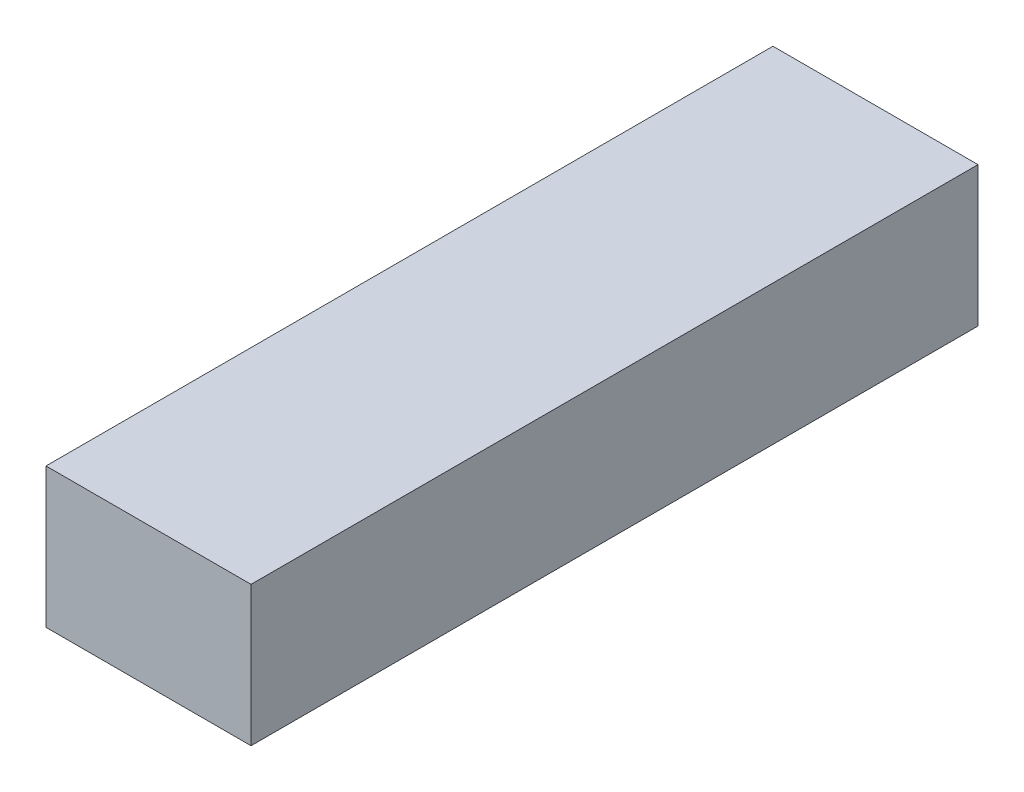
ISO-10303-21;
HEADER;
FILE_DESCRIPTION(('STEP AP214'),'2;1');
FILE_NAME('part.step','',(''),(''),'','','');
FILE_SCHEMA(('AUTOMOTIVE_DESIGN { 1 0 10303 214 1 1 1 1 }'));
ENDSEC;
DATA;
#1=APPLICATION_CONTEXT('core data for automotive mechanical design processes');
#2=APPLICATION_PROTOCOL_DEFINITION('international standard','automotive_design',2000,#1);
#3=PRODUCT_CONTEXT('',#1,'mechanical');
#4=PRODUCT('Part','Part','',(#3));
#5=PRODUCT_RELATED_PRODUCT_CATEGORY('part','',(#4));
#6=PRODUCT_DEFINITION_FORMATION('','',#4);
#7=PRODUCT_DEFINITION_CONTEXT('part definition',#1,'design');
#8=PRODUCT_DEFINITION('design','',#6,#7);
#9=PRODUCT_DEFINITION_SHAPE('','',#8);
#10=(LENGTH_UNIT() NAMED_UNIT(*) SI_UNIT(.MILLI.,.METRE.));
#11=(NAMED_UNIT(*) PLANE_ANGLE_UNIT() SI_UNIT($,.RADIAN.));
#12=(NAMED_UNIT(*) SI_UNIT($,.STERADIAN.) SOLID_ANGLE_UNIT());
#13=UNCERTAINTY_MEASURE_WITH_UNIT(LENGTH_MEASURE(1.E-05),#10,'distance_accuracy_value','');
#14=(GEOMETRIC_REPRESENTATION_CONTEXT(3) GLOBAL_UNCERTAINTY_ASSIGNED_CONTEXT((#13)) GLOBAL_UNIT_ASSIGNED_CONTEXT((#10,
#11,#12)) REPRESENTATION_CONTEXT('',''));
#15=CARTESIAN_POINT('',(0.,0.,0.));
#16=DIRECTION('',(0.,0.,1.));
#17=DIRECTION('',(1.,0.,0.));
#18=AXIS2_PLACEMENT_3D('',#15,#16,#17);
#19=CARTESIAN_POINT('',(0.,0.,0.));
#20=DIRECTION('',(0.,1.,0.));
#21=DIRECTION('',(0.,0.,1.));
#22=AXIS2_PLACEMENT_3D('',#19,#20,#21);
#23=PLANE('',#22);
#24=DIRECTION('',(-1.,0.,0.));
#25=VECTOR('',#24,1.);
#26=CARTESIAN_POINT('',(0.,0.,-29.2));
#27=LINE('',#26,#25);
#28=CARTESIAN_POINT('',(6.8,0.,-29.2));
#29=VERTEX_POINT('',#28);
#30=CARTESIAN_POINT('',(-1.,0.,-29.2));
#31=VERTEX_POINT('',#30);
#32=EDGE_CURVE('E164',#29,#31,#27,.T.);
#33=ORIENTED_EDGE('',*,*,#32,.T.);
#34=DIRECTION('',(0.,0.,1.));
#35=VECTOR('',#34,1.);
#36=CARTESIAN_POINT('',(-1.,0.,1.));
#37=LINE('',#36,#35);
#38=CARTESIAN_POINT('',(-1.,0.,-30.2));
#39=VERTEX_POINT('',#38);
#40=EDGE_CURVE('E142',#39,#31,#37,.T.);
#41=ORIENTED_EDGE('',*,*,#40,.F.);
#42=DIRECTION('',(-1.,0.,0.));
#43=VECTOR('',#42,1.);
#44=CARTESIAN_POINT('',(-1.,0.,-30.2));
#45=LINE('',#44,#43);
#46=CARTESIAN_POINT('',(7.8,0.,-30.2));
#47=VERTEX_POINT('',#46);
#48=EDGE_CURVE('E190',#47,#39,#45,.T.);
#49=ORIENTED_EDGE('',*,*,#48,.F.);
#50=DIRECTION('',(0.,0.,-1.));
#51=VECTOR('',#50,1.);
#52=CARTESIAN_POINT('',(7.8,0.,1.));
#53=LINE('',#52,#51);
#54=CARTESIAN_POINT('',(7.8,0.,1.));
#55=VERTEX_POINT('',#54);
#56=EDGE_CURVE('E188',#55,#47,#53,.T.);
#57=ORIENTED_EDGE('',*,*,#56,.F.);
#58=DIRECTION('',(1.,0.,0.));
#59=VECTOR('',#58,1.);
#60=CARTESIAN_POINT('',(-1.,0.,1.));
#61=LINE('',#60,#59);
#62=CARTESIAN_POINT('',(-1.,0.,1.));
#63=VERTEX_POINT('',#62);
#64=EDGE_CURVE('E185',#63,#55,#61,.T.);
#65=ORIENTED_EDGE('',*,*,#64,.F.);
#66=CARTESIAN_POINT('',(-1.,0.,0.));
#67=VERTEX_POINT('',#66);
#68=EDGE_CURVE('E62',#67,#63,#37,.T.);
#69=ORIENTED_EDGE('',*,*,#68,.F.);
#70=DIRECTION('',(1.,0.,0.));
#71=VECTOR('',#70,1.);
#72=CARTESIAN_POINT('',(0.,0.,0.));
#73=LINE('',#72,#71);
#74=CARTESIAN_POINT('',(6.8,0.,0.));
#75=VERTEX_POINT('',#74);
#76=EDGE_CURVE('E159',#67,#75,#73,.T.);
#77=ORIENTED_EDGE('',*,*,#76,.T.);
#78=DIRECTION('',(0.,0.,-1.));
#79=VECTOR('',#78,1.);
#80=CARTESIAN_POINT('',(6.8,0.,0.));
#81=LINE('',#80,#79);
#82=EDGE_CURVE('E173',#75,#29,#81,.T.);
#83=ORIENTED_EDGE('',*,*,#82,.T.);
#84=EDGE_LOOP('',(#33,#41,#49,#57,#65,#69,#77,#83));
#85=FACE_BOUND('',#84,.T.);
#86=ADVANCED_FACE('F39',(#85),#23,.F.);
#87=CARTESIAN_POINT('',(-1.,5.,1.));
#88=DIRECTION('',(0.,0.,-1.));
#89=DIRECTION('',(-1.,0.,0.));
#90=AXIS2_PLACEMENT_3D('',#87,#88,#89);
#91=PLANE('',#90);
#92=ORIENTED_EDGE('',*,*,#64,.T.);
#93=DIRECTION('',(0.,-1.,0.));
#94=VECTOR('',#93,1.);
#95=CARTESIAN_POINT('',(7.8,5.,1.));
#96=LINE('',#95,#94);
#97=CARTESIAN_POINT('',(7.8,6.,0.999999999999999));
#98=VERTEX_POINT('',#97);
#99=EDGE_CURVE('E11',#98,#55,#96,.T.);
#100=ORIENTED_EDGE('',*,*,#99,.F.);
#101=DIRECTION('',(1.,0.,0.));
#102=VECTOR('',#101,1.);
#103=CARTESIAN_POINT('',(7.8,6.,0.999999999999999));
#104=LINE('',#103,#102);
#105=CARTESIAN_POINT('',(-1.,6.,1.));
#106=VERTEX_POINT('',#105);
#107=EDGE_CURVE('E156',#106,#98,#104,.T.);
#108=ORIENTED_EDGE('',*,*,#107,.F.);
#109=DIRECTION('',(0.,-1.,0.));
#110=VECTOR('',#109,1.);
#111=CARTESIAN_POINT('',(-1.,5.,1.));
#112=LINE('',#111,#110);
#113=EDGE_CURVE('E193',#106,#63,#112,.T.);
#114=ORIENTED_EDGE('',*,*,#113,.T.);
#115=EDGE_LOOP('',(#92,#100,#108,#114));
#116=FACE_BOUND('',#115,.T.);
#117=ADVANCED_FACE('F41',(#116),#91,.F.);
#118=CARTESIAN_POINT('',(7.8,5.,1.));
#119=DIRECTION('',(-1.,0.,0.));
#120=DIRECTION('',(0.,0.,1.));
#121=AXIS2_PLACEMENT_3D('',#118,#119,#120);
#122=PLANE('',#121);
#123=ORIENTED_EDGE('',*,*,#56,.T.);
#124=DIRECTION('',(0.,-1.,0.));
#125=VECTOR('',#124,1.);
#126=CARTESIAN_POINT('',(7.8,5.,-30.2));
#127=LINE('',#126,#125);
#128=CARTESIAN_POINT('',(7.8,6.,-30.2));
#129=VERTEX_POINT('',#128);
#130=EDGE_CURVE('E47',#129,#47,#127,.T.);
#131=ORIENTED_EDGE('',*,*,#130,.F.);
#132=DIRECTION('',(0.,0.,-1.));
#133=VECTOR('',#132,1.);
#134=CARTESIAN_POINT('',(7.8,6.,-30.2));
#135=LINE('',#134,#133);
#136=EDGE_CURVE('E136',#98,#129,#135,.T.);
#137=ORIENTED_EDGE('',*,*,#136,.F.);
#138=ORIENTED_EDGE('',*,*,#99,.T.);
#139=EDGE_LOOP('',(#123,#131,#137,#138));
#140=FACE_BOUND('',#139,.T.);
#141=ADVANCED_FACE('F229',(#140),#122,.F.);
#142=CARTESIAN_POINT('',(-1.,5.,-30.2));
#143=DIRECTION('',(0.,0.,1.));
#144=DIRECTION('',(1.,0.,0.));
#145=AXIS2_PLACEMENT_3D('',#142,#143,#144);
#146=PLANE('',#145);
#147=ORIENTED_EDGE('',*,*,#48,.T.);
#148=DIRECTION('',(0.,-1.,0.));
#149=VECTOR('',#148,1.);
#150=CARTESIAN_POINT('',(-1.,5.,-30.2));
#151=LINE('',#150,#149);
#152=CARTESIAN_POINT('',(-1.,6.,-30.2));
#153=VERTEX_POINT('',#152);
#154=EDGE_CURVE('E195',#153,#39,#151,.T.);
#155=ORIENTED_EDGE('',*,*,#154,.F.);
#156=DIRECTION('',(-1.,0.,0.));
#157=VECTOR('',#156,1.);
#158=CARTESIAN_POINT('',(7.8,6.,-30.2));
#159=LINE('',#158,#157);
#160=EDGE_CURVE('E150',#129,#153,#159,.T.);
#161=ORIENTED_EDGE('',*,*,#160,.F.);
#162=ORIENTED_EDGE('',*,*,#130,.T.);
#163=EDGE_LOOP('',(#147,#155,#161,#162));
#164=FACE_BOUND('',#163,.T.);
#165=ADVANCED_FACE('F200',(#164),#146,.F.);
#166=CARTESIAN_POINT('',(-1.,5.,1.));
#167=DIRECTION('',(1.,0.,0.));
#168=DIRECTION('',(0.,0.,-1.));
#169=AXIS2_PLACEMENT_3D('',#166,#167,#168);
#170=PLANE('',#169);
#171=ORIENTED_EDGE('',*,*,#40,.T.);
#172=DIRECTION('',(0.,-1.,0.));
#173=VECTOR('',#172,1.);
#174=CARTESIAN_POINT('',(-1.,0.,-29.2));
#175=LINE('',#174,#173);
#176=CARTESIAN_POINT('',(-1.,2.,-29.2));
#177=VERTEX_POINT('',#176);
#178=EDGE_CURVE('E122',#177,#31,#175,.T.);
#179=ORIENTED_EDGE('',*,*,#178,.F.);
#180=DIRECTION('',(0.,0.,-1.));
#181=VECTOR('',#180,1.);
#182=CARTESIAN_POINT('',(-1.,2.,-29.2));
#183=LINE('',#182,#181);
#184=CARTESIAN_POINT('',(-1.,2.,0.));
#185=VERTEX_POINT('',#184);
#186=EDGE_CURVE('E132',#185,#177,#183,.T.);
#187=ORIENTED_EDGE('',*,*,#186,.F.);
#188=DIRECTION('',(0.,1.,0.));
#189=VECTOR('',#188,1.);
#190=CARTESIAN_POINT('',(-1.,0.,0.));
#191=LINE('',#190,#189);
#192=EDGE_CURVE('E137',#67,#185,#191,.T.);
#193=ORIENTED_EDGE('',*,*,#192,.F.);
#194=ORIENTED_EDGE('',*,*,#68,.T.);
#195=ORIENTED_EDGE('',*,*,#113,.F.);
#196=DIRECTION('',(0.,0.,1.));
#197=VECTOR('',#196,1.);
#198=CARTESIAN_POINT('',(-1.,6.,-30.2));
#199=LINE('',#198,#197);
#200=EDGE_CURVE('E153',#153,#106,#199,.T.);
#201=ORIENTED_EDGE('',*,*,#200,.F.);
#202=ORIENTED_EDGE('',*,*,#154,.T.);
#203=EDGE_LOOP('',(#171,#179,#187,#193,#194,#195,#201,#202));
#204=FACE_BOUND('',#203,.T.);
#205=ADVANCED_FACE('F139',(#204),#170,.F.);
#206=CARTESIAN_POINT('',(0.,5.,0.));
#207=DIRECTION('',(1.,0.,0.));
#208=DIRECTION('',(0.,0.,-1.));
#209=AXIS2_PLACEMENT_3D('',#206,#207,#208);
#210=PLANE('',#209);
#211=DIRECTION('',(0.,0.,-1.));
#212=VECTOR('',#211,1.);
#213=CARTESIAN_POINT('',(0.,2.,-29.2));
#214=LINE('',#213,#212);
#215=CARTESIAN_POINT('',(0.,2.,0.));
#216=VERTEX_POINT('',#215);
#217=CARTESIAN_POINT('',(0.,2.,-29.2));
#218=VERTEX_POINT('',#217);
#219=EDGE_CURVE('E129',#216,#218,#214,.T.);
#220=ORIENTED_EDGE('',*,*,#219,.T.);
#221=DIRECTION('',(0.,-1.,0.));
#222=VECTOR('',#221,1.);
#223=CARTESIAN_POINT('',(0.,5.,-29.2));
#224=LINE('',#223,#222);
#225=CARTESIAN_POINT('',(0.,5.,-29.2));
#226=VERTEX_POINT('',#225);
#227=EDGE_CURVE('E125',#226,#218,#224,.T.);
#228=ORIENTED_EDGE('',*,*,#227,.F.);
#229=DIRECTION('',(0.,0.,1.));
#230=VECTOR('',#229,1.);
#231=CARTESIAN_POINT('',(0.,5.,0.));
#232=LINE('',#231,#230);
#233=CARTESIAN_POINT('',(0.,5.,0.));
#234=VERTEX_POINT('',#233);
#235=EDGE_CURVE('E160',#226,#234,#232,.T.);
#236=ORIENTED_EDGE('',*,*,#235,.T.);
#237=DIRECTION('',(0.,-1.,0.));
#238=VECTOR('',#237,1.);
#239=CARTESIAN_POINT('',(0.,5.,0.));
#240=LINE('',#239,#238);
#241=EDGE_CURVE('E182',#234,#216,#240,.T.);
#242=ORIENTED_EDGE('',*,*,#241,.T.);
#243=EDGE_LOOP('',(#220,#228,#236,#242));
#244=FACE_BOUND('',#243,.T.);
#245=ADVANCED_FACE('F214',(#244),#210,.T.);
#246=CARTESIAN_POINT('',(0.,5.,0.));
#247=DIRECTION('',(0.,0.,-1.));
#248=DIRECTION('',(-1.,0.,0.));
#249=AXIS2_PLACEMENT_3D('',#246,#247,#248);
#250=PLANE('',#249);
#251=ORIENTED_EDGE('',*,*,#76,.F.);
#252=ORIENTED_EDGE('',*,*,#192,.T.);
#253=DIRECTION('',(-1.,0.,0.));
#254=VECTOR('',#253,1.);
#255=CARTESIAN_POINT('',(7.801,2.,0.));
#256=LINE('',#255,#254);
#257=EDGE_CURVE('E128',#216,#185,#256,.T.);
#258=ORIENTED_EDGE('',*,*,#257,.F.);
#259=ORIENTED_EDGE('',*,*,#241,.F.);
#260=DIRECTION('',(1.,0.,0.));
#261=VECTOR('',#260,1.);
#262=CARTESIAN_POINT('',(0.,5.,0.));
#263=LINE('',#262,#261);
#264=CARTESIAN_POINT('',(6.8,5.,0.));
#265=VERTEX_POINT('',#264);
#266=EDGE_CURVE('E163',#234,#265,#263,.T.);
#267=ORIENTED_EDGE('',*,*,#266,.T.);
#268=DIRECTION('',(0.,-1.,0.));
#269=VECTOR('',#268,1.);
#270=CARTESIAN_POINT('',(6.8,5.,0.));
#271=LINE('',#270,#269);
#272=EDGE_CURVE('E180',#265,#75,#271,.T.);
#273=ORIENTED_EDGE('',*,*,#272,.T.);
#274=EDGE_LOOP('',(#251,#252,#258,#259,#267,#273));
#275=FACE_BOUND('',#274,.T.);
#276=ADVANCED_FACE('F212',(#275),#250,.T.);
#277=CARTESIAN_POINT('',(6.8,5.,0.));
#278=DIRECTION('',(-1.,0.,0.));
#279=DIRECTION('',(0.,0.,1.));
#280=AXIS2_PLACEMENT_3D('',#277,#278,#279);
#281=PLANE('',#280);
#282=ORIENTED_EDGE('',*,*,#82,.F.);
#283=ORIENTED_EDGE('',*,*,#272,.F.);
#284=DIRECTION('',(0.,0.,-1.));
#285=VECTOR('',#284,1.);
#286=CARTESIAN_POINT('',(6.8,5.,0.));
#287=LINE('',#286,#285);
#288=CARTESIAN_POINT('',(6.8,5.,-29.2));
#289=VERTEX_POINT('',#288);
#290=EDGE_CURVE('E167',#265,#289,#287,.T.);
#291=ORIENTED_EDGE('',*,*,#290,.T.);
#292=DIRECTION('',(0.,-1.,0.));
#293=VECTOR('',#292,1.);
#294=CARTESIAN_POINT('',(6.8,5.,-29.2));
#295=LINE('',#294,#293);
#296=EDGE_CURVE('E178',#289,#29,#295,.T.);
#297=ORIENTED_EDGE('',*,*,#296,.T.);
#298=EDGE_LOOP('',(#282,#283,#291,#297));
#299=FACE_BOUND('',#298,.T.);
#300=ADVANCED_FACE('F208',(#299),#281,.T.);
#301=CARTESIAN_POINT('',(0.,5.,-29.2));
#302=DIRECTION('',(0.,0.,1.));
#303=DIRECTION('',(1.,0.,0.));
#304=AXIS2_PLACEMENT_3D('',#301,#302,#303);
#305=PLANE('',#304);
#306=ORIENTED_EDGE('',*,*,#32,.F.);
#307=ORIENTED_EDGE('',*,*,#296,.F.);
#308=DIRECTION('',(-1.,0.,0.));
#309=VECTOR('',#308,1.);
#310=CARTESIAN_POINT('',(0.,5.,-29.2));
#311=LINE('',#310,#309);
#312=EDGE_CURVE('E54',#289,#226,#311,.T.);
#313=ORIENTED_EDGE('',*,*,#312,.T.);
#314=ORIENTED_EDGE('',*,*,#227,.T.);
#315=DIRECTION('',(-1.,0.,0.));
#316=VECTOR('',#315,1.);
#317=CARTESIAN_POINT('',(7.801,2.,-29.2));
#318=LINE('',#317,#316);
#319=EDGE_CURVE('E117',#218,#177,#318,.T.);
#320=ORIENTED_EDGE('',*,*,#319,.T.);
#321=ORIENTED_EDGE('',*,*,#178,.T.);
#322=EDGE_LOOP('',(#306,#307,#313,#314,#320,#321));
#323=FACE_BOUND('',#322,.T.);
#324=ADVANCED_FACE('F120',(#323),#305,.T.);
#325=CARTESIAN_POINT('',(0.,5.,0.));
#326=DIRECTION('',(0.,-1.,0.));
#327=DIRECTION('',(0.,0.,-1.));
#328=AXIS2_PLACEMENT_3D('',#325,#326,#327);
#329=PLANE('',#328);
#330=ORIENTED_EDGE('',*,*,#266,.F.);
#331=ORIENTED_EDGE('',*,*,#235,.F.);
#332=ORIENTED_EDGE('',*,*,#312,.F.);
#333=ORIENTED_EDGE('',*,*,#290,.F.);
#334=EDGE_LOOP('',(#330,#331,#332,#333));
#335=FACE_BOUND('',#334,.T.);
#336=ADVANCED_FACE('F209',(#335),#329,.T.);
#337=CARTESIAN_POINT('',(0.,6.,0.));
#338=DIRECTION('',(0.,-1.,0.));
#339=DIRECTION('',(0.,0.,-1.));
#340=AXIS2_PLACEMENT_3D('',#337,#338,#339);
#341=PLANE('',#340);
#342=ORIENTED_EDGE('',*,*,#136,.T.);
#343=ORIENTED_EDGE('',*,*,#160,.T.);
#344=ORIENTED_EDGE('',*,*,#200,.T.);
#345=ORIENTED_EDGE('',*,*,#107,.T.);
#346=EDGE_LOOP('',(#342,#343,#344,#345));
#347=FACE_BOUND('',#346,.T.);
#348=ADVANCED_FACE('F239',(#347),#341,.F.);
#349=CARTESIAN_POINT('',(7.801,2.,-29.2));
#350=DIRECTION('',(0.,1.,0.));
#351=DIRECTION('',(0.,0.,1.));
#352=AXIS2_PLACEMENT_3D('',#349,#350,#351);
#353=PLANE('',#352);
#354=ORIENTED_EDGE('',*,*,#257,.T.);
#355=ORIENTED_EDGE('',*,*,#186,.T.);
#356=ORIENTED_EDGE('',*,*,#319,.F.);
#357=ORIENTED_EDGE('',*,*,#219,.F.);
#358=EDGE_LOOP('',(#354,#355,#356,#357));
#359=FACE_BOUND('',#358,.T.);
#360=ADVANCED_FACE('F133',(#359),#353,.F.);
#361=CLOSED_SHELL('',(#86,#117,#141,#165,#205,#245,#276,#300,#324,#336,#348,#360));
#362=MANIFOLD_SOLID_BREP('B2',#361);
#363=ADVANCED_BREP_SHAPE_REPRESENTATION('',(#18,#362),#14);
#364=SHAPE_DEFINITION_REPRESENTATION(#9,#363);
ENDSEC;
END-ISO-10303-21;
